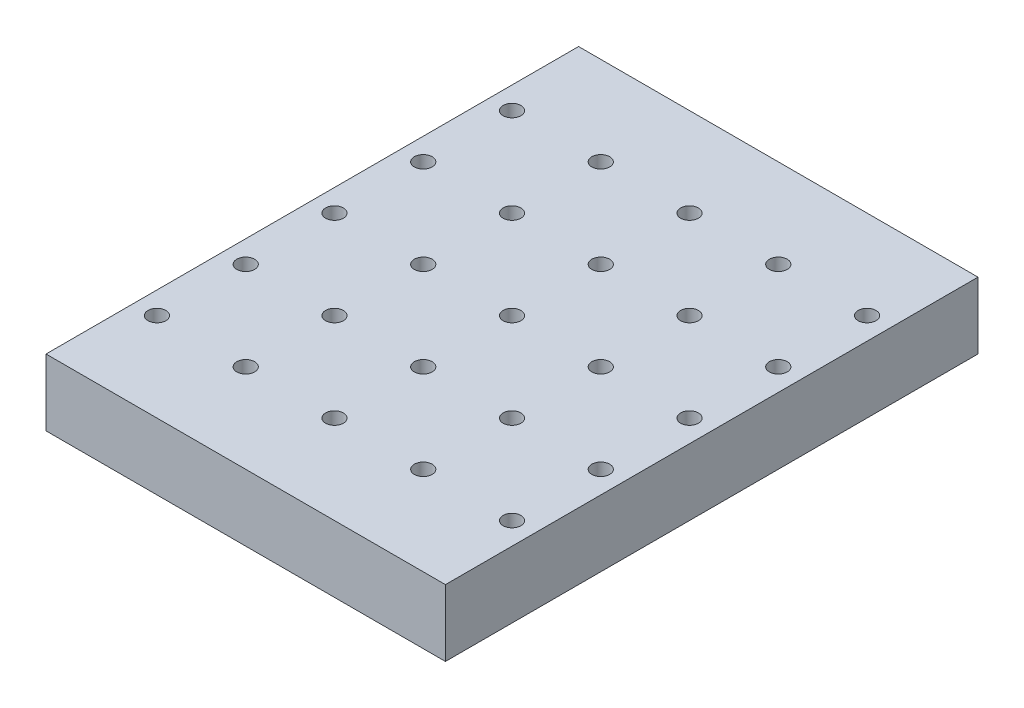
ISO-10303-21;
HEADER;
FILE_DESCRIPTION(('STEP AP214'),'2;1');
FILE_NAME('part.step','',(''),(''),'','','');
FILE_SCHEMA(('AUTOMOTIVE_DESIGN { 1 0 10303 214 1 1 1 1 }'));
ENDSEC;
DATA;
#1=APPLICATION_CONTEXT('core data for automotive mechanical design processes');
#2=APPLICATION_PROTOCOL_DEFINITION('international standard','automotive_design',2000,#1);
#3=PRODUCT_CONTEXT('',#1,'mechanical');
#4=PRODUCT('Part','Part','',(#3));
#5=PRODUCT_RELATED_PRODUCT_CATEGORY('part','',(#4));
#6=PRODUCT_DEFINITION_FORMATION('','',#4);
#7=PRODUCT_DEFINITION_CONTEXT('part definition',#1,'design');
#8=PRODUCT_DEFINITION('design','',#6,#7);
#9=PRODUCT_DEFINITION_SHAPE('','',#8);
#10=(LENGTH_UNIT() NAMED_UNIT(*) SI_UNIT(.MILLI.,.METRE.));
#11=(NAMED_UNIT(*) PLANE_ANGLE_UNIT() SI_UNIT($,.RADIAN.));
#12=(NAMED_UNIT(*) SI_UNIT($,.STERADIAN.) SOLID_ANGLE_UNIT());
#13=UNCERTAINTY_MEASURE_WITH_UNIT(LENGTH_MEASURE(1.E-05),#10,'distance_accuracy_value','');
#14=(GEOMETRIC_REPRESENTATION_CONTEXT(3) GLOBAL_UNCERTAINTY_ASSIGNED_CONTEXT((#13)) GLOBAL_UNIT_ASSIGNED_CONTEXT((#10,
#11,#12)) REPRESENTATION_CONTEXT('',''));
#15=CARTESIAN_POINT('',(0.,0.,0.));
#16=DIRECTION('',(0.,0.,1.));
#17=DIRECTION('',(1.,0.,0.));
#18=AXIS2_PLACEMENT_3D('',#15,#16,#17);
#19=CARTESIAN_POINT('',(-57.15,19.05,76.2));
#20=DIRECTION('',(1.,0.,0.));
#21=DIRECTION('',(0.,0.,-1.));
#22=AXIS2_PLACEMENT_3D('',#19,#20,#21);
#23=PLANE('',#22);
#24=DIRECTION('',(0.,0.,1.));
#25=VECTOR('',#24,1.);
#26=CARTESIAN_POINT('',(-57.15,0.,76.2));
#27=LINE('',#26,#25);
#28=CARTESIAN_POINT('',(-57.15,0.,-76.2));
#29=VERTEX_POINT('',#28);
#30=CARTESIAN_POINT('',(-57.15,0.,76.2));
#31=VERTEX_POINT('',#30);
#32=EDGE_CURVE('E100',#29,#31,#27,.T.);
#33=ORIENTED_EDGE('',*,*,#32,.T.);
#34=DIRECTION('',(0.,-1.,0.));
#35=VECTOR('',#34,1.);
#36=CARTESIAN_POINT('',(-57.15,19.05,76.2));
#37=LINE('',#36,#35);
#38=CARTESIAN_POINT('',(-57.15,19.05,76.2));
#39=VERTEX_POINT('',#38);
#40=EDGE_CURVE('E11',#39,#31,#37,.T.);
#41=ORIENTED_EDGE('',*,*,#40,.F.);
#42=DIRECTION('',(0.,0.,1.));
#43=VECTOR('',#42,1.);
#44=CARTESIAN_POINT('',(-57.15,19.05,76.2));
#45=LINE('',#44,#43);
#46=CARTESIAN_POINT('',(-57.15,19.05,-76.2));
#47=VERTEX_POINT('',#46);
#48=EDGE_CURVE('E88',#47,#39,#45,.T.);
#49=ORIENTED_EDGE('',*,*,#48,.F.);
#50=DIRECTION('',(0.,-1.,0.));
#51=VECTOR('',#50,1.);
#52=CARTESIAN_POINT('',(-57.15,19.05,-76.2));
#53=LINE('',#52,#51);
#54=EDGE_CURVE('E96',#47,#29,#53,.T.);
#55=ORIENTED_EDGE('',*,*,#54,.T.);
#56=EDGE_LOOP('',(#33,#41,#49,#55));
#57=FACE_BOUND('',#56,.T.);
#58=ADVANCED_FACE('F37',(#57),#23,.F.);
#59=CARTESIAN_POINT('',(57.15,19.05,76.2));
#60=DIRECTION('',(0.,0.,-1.));
#61=DIRECTION('',(-1.,0.,0.));
#62=AXIS2_PLACEMENT_3D('',#59,#60,#61);
#63=PLANE('',#62);
#64=DIRECTION('',(1.,0.,0.));
#65=VECTOR('',#64,1.);
#66=CARTESIAN_POINT('',(57.15,0.,76.2));
#67=LINE('',#66,#65);
#68=CARTESIAN_POINT('',(57.15,0.,76.2));
#69=VERTEX_POINT('',#68);
#70=EDGE_CURVE('E92',#31,#69,#67,.T.);
#71=ORIENTED_EDGE('',*,*,#70,.T.);
#72=DIRECTION('',(0.,-1.,0.));
#73=VECTOR('',#72,1.);
#74=CARTESIAN_POINT('',(57.15,19.05,76.2));
#75=LINE('',#74,#73);
#76=CARTESIAN_POINT('',(57.15,19.05,76.2));
#77=VERTEX_POINT('',#76);
#78=EDGE_CURVE('E45',#77,#69,#75,.T.);
#79=ORIENTED_EDGE('',*,*,#78,.F.);
#80=DIRECTION('',(1.,0.,0.));
#81=VECTOR('',#80,1.);
#82=CARTESIAN_POINT('',(57.15,19.05,76.2));
#83=LINE('',#82,#81);
#84=EDGE_CURVE('E83',#39,#77,#83,.T.);
#85=ORIENTED_EDGE('',*,*,#84,.F.);
#86=ORIENTED_EDGE('',*,*,#40,.T.);
#87=EDGE_LOOP('',(#71,#79,#85,#86));
#88=FACE_BOUND('',#87,.T.);
#89=ADVANCED_FACE('F91',(#88),#63,.F.);
#90=CARTESIAN_POINT('',(57.15,19.05,76.2));
#91=DIRECTION('',(-1.,0.,0.));
#92=DIRECTION('',(0.,0.,1.));
#93=AXIS2_PLACEMENT_3D('',#90,#91,#92);
#94=PLANE('',#93);
#95=DIRECTION('',(0.,0.,-1.));
#96=VECTOR('',#95,1.);
#97=CARTESIAN_POINT('',(57.15,0.,76.2));
#98=LINE('',#97,#96);
#99=CARTESIAN_POINT('',(57.15,0.,-76.2));
#100=VERTEX_POINT('',#99);
#101=EDGE_CURVE('E70',#69,#100,#98,.T.);
#102=ORIENTED_EDGE('',*,*,#101,.T.);
#103=DIRECTION('',(0.,-1.,0.));
#104=VECTOR('',#103,1.);
#105=CARTESIAN_POINT('',(57.15,19.05,-76.2));
#106=LINE('',#105,#104);
#107=CARTESIAN_POINT('',(57.15,19.05,-76.2));
#108=VERTEX_POINT('',#107);
#109=EDGE_CURVE('E93',#108,#100,#106,.T.);
#110=ORIENTED_EDGE('',*,*,#109,.F.);
#111=DIRECTION('',(0.,0.,-1.));
#112=VECTOR('',#111,1.);
#113=CARTESIAN_POINT('',(57.15,19.05,76.2));
#114=LINE('',#113,#112);
#115=EDGE_CURVE('E86',#77,#108,#114,.T.);
#116=ORIENTED_EDGE('',*,*,#115,.F.);
#117=ORIENTED_EDGE('',*,*,#78,.T.);
#118=EDGE_LOOP('',(#102,#110,#116,#117));
#119=FACE_BOUND('',#118,.T.);
#120=ADVANCED_FACE('F94',(#119),#94,.F.);
#121=CARTESIAN_POINT('',(57.15,19.05,-76.2));
#122=DIRECTION('',(0.,0.,1.));
#123=DIRECTION('',(1.,0.,0.));
#124=AXIS2_PLACEMENT_3D('',#121,#122,#123);
#125=PLANE('',#124);
#126=DIRECTION('',(-1.,0.,0.));
#127=VECTOR('',#126,1.);
#128=CARTESIAN_POINT('',(57.15,0.,-76.2));
#129=LINE('',#128,#127);
#130=EDGE_CURVE('E76',#100,#29,#129,.T.);
#131=ORIENTED_EDGE('',*,*,#130,.T.);
#132=ORIENTED_EDGE('',*,*,#54,.F.);
#133=DIRECTION('',(-1.,0.,0.));
#134=VECTOR('',#133,1.);
#135=CARTESIAN_POINT('',(57.15,19.05,-76.2));
#136=LINE('',#135,#134);
#137=EDGE_CURVE('E53',#108,#47,#136,.T.);
#138=ORIENTED_EDGE('',*,*,#137,.F.);
#139=ORIENTED_EDGE('',*,*,#109,.T.);
#140=EDGE_LOOP('',(#131,#132,#138,#139));
#141=FACE_BOUND('',#140,.T.);
#142=ADVANCED_FACE('F108',(#141),#125,.F.);
#143=CARTESIAN_POINT('',(0.,19.05,0.));
#144=DIRECTION('',(0.,1.,0.));
#145=DIRECTION('',(0.,0.,1.));
#146=AXIS2_PLACEMENT_3D('',#143,#144,#145);
#147=PLANE('',#146);
#148=CARTESIAN_POINT('',(50.8,19.05,50.8));
#149=DIRECTION('',(0.,1.,0.));
#150=DIRECTION('',(0.,0.,1.));
#151=AXIS2_PLACEMENT_3D('',#148,#149,#150);
#152=CIRCLE('',#151,2.55269999999999);
#153=CARTESIAN_POINT('',(50.8,19.05,53.3527));
#154=VERTEX_POINT('',#153);
#155=EDGE_CURVE('E260',#154,#154,#152,.T.);
#156=ORIENTED_EDGE('',*,*,#155,.F.);
#157=EDGE_LOOP('',(#156));
#158=FACE_BOUND('',#157,.T.);
#159=CARTESIAN_POINT('',(50.8,19.05,25.4));
#160=DIRECTION('',(0.,1.,0.));
#161=DIRECTION('',(0.,0.,1.));
#162=AXIS2_PLACEMENT_3D('',#159,#160,#161);
#163=CIRCLE('',#162,2.55269999999999);
#164=CARTESIAN_POINT('',(50.8,19.05,27.9527));
#165=VERTEX_POINT('',#164);
#166=EDGE_CURVE('E254',#165,#165,#163,.T.);
#167=ORIENTED_EDGE('',*,*,#166,.F.);
#168=EDGE_LOOP('',(#167));
#169=FACE_BOUND('',#168,.T.);
#170=CARTESIAN_POINT('',(50.8,19.05,-50.8));
#171=DIRECTION('',(0.,1.,0.));
#172=DIRECTION('',(0.,0.,1.));
#173=AXIS2_PLACEMENT_3D('',#170,#171,#172);
#174=CIRCLE('',#173,2.55269999999999);
#175=CARTESIAN_POINT('',(50.8,19.05,-48.2473));
#176=VERTEX_POINT('',#175);
#177=EDGE_CURVE('E248',#176,#176,#174,.T.);
#178=ORIENTED_EDGE('',*,*,#177,.F.);
#179=EDGE_LOOP('',(#178));
#180=FACE_BOUND('',#179,.T.);
#181=CARTESIAN_POINT('',(50.8,19.05,-25.4));
#182=DIRECTION('',(0.,1.,0.));
#183=DIRECTION('',(0.,0.,1.));
#184=AXIS2_PLACEMENT_3D('',#181,#182,#183);
#185=CIRCLE('',#184,2.55269999999999);
#186=CARTESIAN_POINT('',(50.8,19.05,-22.8473));
#187=VERTEX_POINT('',#186);
#188=EDGE_CURVE('E242',#187,#187,#185,.T.);
#189=ORIENTED_EDGE('',*,*,#188,.F.);
#190=EDGE_LOOP('',(#189));
#191=FACE_BOUND('',#190,.T.);
#192=CARTESIAN_POINT('',(50.8,19.05,0.));
#193=DIRECTION('',(0.,1.,0.));
#194=DIRECTION('',(0.,0.,1.));
#195=AXIS2_PLACEMENT_3D('',#192,#193,#194);
#196=CIRCLE('',#195,2.55269999999999);
#197=CARTESIAN_POINT('',(50.8,19.05,2.55269999999998));
#198=VERTEX_POINT('',#197);
#199=EDGE_CURVE('E236',#198,#198,#196,.T.);
#200=ORIENTED_EDGE('',*,*,#199,.F.);
#201=EDGE_LOOP('',(#200));
#202=FACE_BOUND('',#201,.T.);
#203=CARTESIAN_POINT('',(25.4,19.05,50.8));
#204=DIRECTION('',(0.,1.,0.));
#205=DIRECTION('',(0.,0.,1.));
#206=AXIS2_PLACEMENT_3D('',#203,#204,#205);
#207=CIRCLE('',#206,2.55269999999999);
#208=CARTESIAN_POINT('',(25.4,19.05,53.3527));
#209=VERTEX_POINT('',#208);
#210=EDGE_CURVE('E230',#209,#209,#207,.T.);
#211=ORIENTED_EDGE('',*,*,#210,.F.);
#212=EDGE_LOOP('',(#211));
#213=FACE_BOUND('',#212,.T.);
#214=CARTESIAN_POINT('',(25.4,19.05,25.4));
#215=DIRECTION('',(0.,1.,0.));
#216=DIRECTION('',(0.,0.,1.));
#217=AXIS2_PLACEMENT_3D('',#214,#215,#216);
#218=CIRCLE('',#217,2.55269999999999);
#219=CARTESIAN_POINT('',(25.4,19.05,27.9527));
#220=VERTEX_POINT('',#219);
#221=EDGE_CURVE('E224',#220,#220,#218,.T.);
#222=ORIENTED_EDGE('',*,*,#221,.F.);
#223=EDGE_LOOP('',(#222));
#224=FACE_BOUND('',#223,.T.);
#225=CARTESIAN_POINT('',(25.4,19.05,-50.8));
#226=DIRECTION('',(0.,1.,0.));
#227=DIRECTION('',(0.,0.,1.));
#228=AXIS2_PLACEMENT_3D('',#225,#226,#227);
#229=CIRCLE('',#228,2.55269999999999);
#230=CARTESIAN_POINT('',(25.4,19.05,-48.2473));
#231=VERTEX_POINT('',#230);
#232=EDGE_CURVE('E218',#231,#231,#229,.T.);
#233=ORIENTED_EDGE('',*,*,#232,.F.);
#234=EDGE_LOOP('',(#233));
#235=FACE_BOUND('',#234,.T.);
#236=CARTESIAN_POINT('',(25.4,19.05,-25.4));
#237=DIRECTION('',(0.,1.,0.));
#238=DIRECTION('',(0.,0.,1.));
#239=AXIS2_PLACEMENT_3D('',#236,#237,#238);
#240=CIRCLE('',#239,2.55269999999999);
#241=CARTESIAN_POINT('',(25.4,19.05,-22.8473));
#242=VERTEX_POINT('',#241);
#243=EDGE_CURVE('E212',#242,#242,#240,.T.);
#244=ORIENTED_EDGE('',*,*,#243,.F.);
#245=EDGE_LOOP('',(#244));
#246=FACE_BOUND('',#245,.T.);
#247=CARTESIAN_POINT('',(25.4,19.05,0.));
#248=DIRECTION('',(0.,1.,0.));
#249=DIRECTION('',(0.,0.,1.));
#250=AXIS2_PLACEMENT_3D('',#247,#248,#249);
#251=CIRCLE('',#250,2.55269999999999);
#252=CARTESIAN_POINT('',(25.4,19.05,2.55269999999998));
#253=VERTEX_POINT('',#252);
#254=EDGE_CURVE('E206',#253,#253,#251,.T.);
#255=ORIENTED_EDGE('',*,*,#254,.F.);
#256=EDGE_LOOP('',(#255));
#257=FACE_BOUND('',#256,.T.);
#258=CARTESIAN_POINT('',(-50.8,19.05,50.8));
#259=DIRECTION('',(0.,1.,0.));
#260=DIRECTION('',(0.,0.,1.));
#261=AXIS2_PLACEMENT_3D('',#258,#259,#260);
#262=CIRCLE('',#261,2.55269999999999);
#263=CARTESIAN_POINT('',(-50.8,19.05,53.3527));
#264=VERTEX_POINT('',#263);
#265=EDGE_CURVE('E200',#264,#264,#262,.T.);
#266=ORIENTED_EDGE('',*,*,#265,.F.);
#267=EDGE_LOOP('',(#266));
#268=FACE_BOUND('',#267,.T.);
#269=CARTESIAN_POINT('',(-50.8,19.05,25.4));
#270=DIRECTION('',(0.,1.,0.));
#271=DIRECTION('',(0.,0.,1.));
#272=AXIS2_PLACEMENT_3D('',#269,#270,#271);
#273=CIRCLE('',#272,2.55269999999999);
#274=CARTESIAN_POINT('',(-50.8,19.05,27.9527));
#275=VERTEX_POINT('',#274);
#276=EDGE_CURVE('E194',#275,#275,#273,.T.);
#277=ORIENTED_EDGE('',*,*,#276,.F.);
#278=EDGE_LOOP('',(#277));
#279=FACE_BOUND('',#278,.T.);
#280=CARTESIAN_POINT('',(-50.8,19.05,-50.8));
#281=DIRECTION('',(0.,1.,0.));
#282=DIRECTION('',(0.,0.,1.));
#283=AXIS2_PLACEMENT_3D('',#280,#281,#282);
#284=CIRCLE('',#283,2.55269999999999);
#285=CARTESIAN_POINT('',(-50.8,19.05,-48.2473));
#286=VERTEX_POINT('',#285);
#287=EDGE_CURVE('E188',#286,#286,#284,.T.);
#288=ORIENTED_EDGE('',*,*,#287,.F.);
#289=EDGE_LOOP('',(#288));
#290=FACE_BOUND('',#289,.T.);
#291=CARTESIAN_POINT('',(-50.8,19.05,-25.4));
#292=DIRECTION('',(0.,1.,0.));
#293=DIRECTION('',(0.,0.,1.));
#294=AXIS2_PLACEMENT_3D('',#291,#292,#293);
#295=CIRCLE('',#294,2.55269999999999);
#296=CARTESIAN_POINT('',(-50.8,19.05,-22.8473));
#297=VERTEX_POINT('',#296);
#298=EDGE_CURVE('E182',#297,#297,#295,.T.);
#299=ORIENTED_EDGE('',*,*,#298,.F.);
#300=EDGE_LOOP('',(#299));
#301=FACE_BOUND('',#300,.T.);
#302=CARTESIAN_POINT('',(-50.8,19.05,0.));
#303=DIRECTION('',(0.,1.,0.));
#304=DIRECTION('',(0.,0.,1.));
#305=AXIS2_PLACEMENT_3D('',#302,#303,#304);
#306=CIRCLE('',#305,2.55269999999999);
#307=CARTESIAN_POINT('',(-50.8,19.05,2.5527));
#308=VERTEX_POINT('',#307);
#309=EDGE_CURVE('E176',#308,#308,#306,.T.);
#310=ORIENTED_EDGE('',*,*,#309,.F.);
#311=EDGE_LOOP('',(#310));
#312=FACE_BOUND('',#311,.T.);
#313=CARTESIAN_POINT('',(-25.4,19.05,50.8));
#314=DIRECTION('',(0.,1.,0.));
#315=DIRECTION('',(0.,0.,1.));
#316=AXIS2_PLACEMENT_3D('',#313,#314,#315);
#317=CIRCLE('',#316,2.55269999999999);
#318=CARTESIAN_POINT('',(-25.4,19.05,53.3527));
#319=VERTEX_POINT('',#318);
#320=EDGE_CURVE('E170',#319,#319,#317,.T.);
#321=ORIENTED_EDGE('',*,*,#320,.F.);
#322=EDGE_LOOP('',(#321));
#323=FACE_BOUND('',#322,.T.);
#324=CARTESIAN_POINT('',(-25.4,19.05,25.4));
#325=DIRECTION('',(0.,1.,0.));
#326=DIRECTION('',(0.,0.,1.));
#327=AXIS2_PLACEMENT_3D('',#324,#325,#326);
#328=CIRCLE('',#327,2.55269999999999);
#329=CARTESIAN_POINT('',(-25.4,19.05,27.9527));
#330=VERTEX_POINT('',#329);
#331=EDGE_CURVE('E164',#330,#330,#328,.T.);
#332=ORIENTED_EDGE('',*,*,#331,.F.);
#333=EDGE_LOOP('',(#332));
#334=FACE_BOUND('',#333,.T.);
#335=CARTESIAN_POINT('',(-25.4,19.05,-50.8));
#336=DIRECTION('',(0.,1.,0.));
#337=DIRECTION('',(0.,0.,1.));
#338=AXIS2_PLACEMENT_3D('',#335,#336,#337);
#339=CIRCLE('',#338,2.55269999999999);
#340=CARTESIAN_POINT('',(-25.4,19.05,-48.2473));
#341=VERTEX_POINT('',#340);
#342=EDGE_CURVE('E158',#341,#341,#339,.T.);
#343=ORIENTED_EDGE('',*,*,#342,.F.);
#344=EDGE_LOOP('',(#343));
#345=FACE_BOUND('',#344,.T.);
#346=CARTESIAN_POINT('',(-25.4,19.05,-25.4));
#347=DIRECTION('',(0.,1.,0.));
#348=DIRECTION('',(0.,0.,1.));
#349=AXIS2_PLACEMENT_3D('',#346,#347,#348);
#350=CIRCLE('',#349,2.55269999999999);
#351=CARTESIAN_POINT('',(-25.4,19.05,-22.8473));
#352=VERTEX_POINT('',#351);
#353=EDGE_CURVE('E152',#352,#352,#350,.T.);
#354=ORIENTED_EDGE('',*,*,#353,.F.);
#355=EDGE_LOOP('',(#354));
#356=FACE_BOUND('',#355,.T.);
#357=CARTESIAN_POINT('',(-25.4,19.05,0.));
#358=DIRECTION('',(0.,1.,0.));
#359=DIRECTION('',(0.,0.,1.));
#360=AXIS2_PLACEMENT_3D('',#357,#358,#359);
#361=CIRCLE('',#360,2.55269999999999);
#362=CARTESIAN_POINT('',(-25.4,19.05,2.55269999999999));
#363=VERTEX_POINT('',#362);
#364=EDGE_CURVE('E146',#363,#363,#361,.T.);
#365=ORIENTED_EDGE('',*,*,#364,.F.);
#366=EDGE_LOOP('',(#365));
#367=FACE_BOUND('',#366,.T.);
#368=CARTESIAN_POINT('',(0.,19.05,50.8));
#369=DIRECTION('',(0.,1.,0.));
#370=DIRECTION('',(0.,0.,1.));
#371=AXIS2_PLACEMENT_3D('',#368,#369,#370);
#372=CIRCLE('',#371,2.55269999999999);
#373=CARTESIAN_POINT('',(0.,19.05,53.3527));
#374=VERTEX_POINT('',#373);
#375=EDGE_CURVE('E140',#374,#374,#372,.T.);
#376=ORIENTED_EDGE('',*,*,#375,.F.);
#377=EDGE_LOOP('',(#376));
#378=FACE_BOUND('',#377,.T.);
#379=CARTESIAN_POINT('',(0.,19.05,25.4));
#380=DIRECTION('',(0.,1.,0.));
#381=DIRECTION('',(0.,0.,1.));
#382=AXIS2_PLACEMENT_3D('',#379,#380,#381);
#383=CIRCLE('',#382,2.55269999999999);
#384=CARTESIAN_POINT('',(0.,19.05,27.9527));
#385=VERTEX_POINT('',#384);
#386=EDGE_CURVE('E134',#385,#385,#383,.T.);
#387=ORIENTED_EDGE('',*,*,#386,.F.);
#388=EDGE_LOOP('',(#387));
#389=FACE_BOUND('',#388,.T.);
#390=CARTESIAN_POINT('',(0.,19.05,-50.8));
#391=DIRECTION('',(0.,1.,0.));
#392=DIRECTION('',(0.,0.,1.));
#393=AXIS2_PLACEMENT_3D('',#390,#391,#392);
#394=CIRCLE('',#393,2.55269999999999);
#395=CARTESIAN_POINT('',(0.,19.05,-48.2473));
#396=VERTEX_POINT('',#395);
#397=EDGE_CURVE('E128',#396,#396,#394,.T.);
#398=ORIENTED_EDGE('',*,*,#397,.F.);
#399=EDGE_LOOP('',(#398));
#400=FACE_BOUND('',#399,.T.);
#401=CARTESIAN_POINT('',(0.,19.05,-25.4));
#402=DIRECTION('',(0.,1.,0.));
#403=DIRECTION('',(0.,0.,1.));
#404=AXIS2_PLACEMENT_3D('',#401,#402,#403);
#405=CIRCLE('',#404,2.55269999999999);
#406=CARTESIAN_POINT('',(0.,19.05,-22.8473));
#407=VERTEX_POINT('',#406);
#408=EDGE_CURVE('E122',#407,#407,#405,.T.);
#409=ORIENTED_EDGE('',*,*,#408,.F.);
#410=EDGE_LOOP('',(#409));
#411=FACE_BOUND('',#410,.T.);
#412=CARTESIAN_POINT('',(0.,19.05,0.));
#413=DIRECTION('',(0.,1.,0.));
#414=DIRECTION('',(0.,0.,1.));
#415=AXIS2_PLACEMENT_3D('',#412,#413,#414);
#416=CIRCLE('',#415,2.55269999999999);
#417=CARTESIAN_POINT('',(0.,19.05,2.55269999999999));
#418=VERTEX_POINT('',#417);
#419=EDGE_CURVE('E116',#418,#418,#416,.T.);
#420=ORIENTED_EDGE('',*,*,#419,.F.);
#421=EDGE_LOOP('',(#420));
#422=FACE_BOUND('',#421,.T.);
#423=ORIENTED_EDGE('',*,*,#48,.T.);
#424=ORIENTED_EDGE('',*,*,#84,.T.);
#425=ORIENTED_EDGE('',*,*,#115,.T.);
#426=ORIENTED_EDGE('',*,*,#137,.T.);
#427=EDGE_LOOP('',(#423,#424,#425,#426));
#428=FACE_BOUND('',#427,.T.);
#429=ADVANCED_FACE('F84',(#158,#169,#180,#191,#202,#213,#224,#235,#246,#257,#268,#279,#290,#301,
#312,#323,#334,#345,#356,#367,#378,#389,#400,#411,#422,#428),#147,.T.);
#430=CARTESIAN_POINT('',(0.,0.,0.));
#431=DIRECTION('',(0.,1.,0.));
#432=DIRECTION('',(0.,0.,1.));
#433=AXIS2_PLACEMENT_3D('',#430,#431,#432);
#434=PLANE('',#433);
#435=CARTESIAN_POINT('',(50.8,0.,50.8));
#436=DIRECTION('',(0.,1.,0.));
#437=DIRECTION('',(0.,0.,1.));
#438=AXIS2_PLACEMENT_3D('',#435,#436,#437);
#439=CIRCLE('',#438,2.5527);
#440=CARTESIAN_POINT('',(50.8,0.,53.3527));
#441=VERTEX_POINT('',#440);
#442=EDGE_CURVE('E257',#441,#441,#439,.T.);
#443=ORIENTED_EDGE('',*,*,#442,.T.);
#444=EDGE_LOOP('',(#443));
#445=FACE_BOUND('',#444,.T.);
#446=CARTESIAN_POINT('',(50.8,0.,25.4));
#447=DIRECTION('',(0.,1.,0.));
#448=DIRECTION('',(0.,0.,1.));
#449=AXIS2_PLACEMENT_3D('',#446,#447,#448);
#450=CIRCLE('',#449,2.5527);
#451=CARTESIAN_POINT('',(50.8,0.,27.9527));
#452=VERTEX_POINT('',#451);
#453=EDGE_CURVE('E251',#452,#452,#450,.T.);
#454=ORIENTED_EDGE('',*,*,#453,.T.);
#455=EDGE_LOOP('',(#454));
#456=FACE_BOUND('',#455,.T.);
#457=CARTESIAN_POINT('',(50.8,0.,-50.8));
#458=DIRECTION('',(0.,1.,0.));
#459=DIRECTION('',(0.,0.,1.));
#460=AXIS2_PLACEMENT_3D('',#457,#458,#459);
#461=CIRCLE('',#460,2.5527);
#462=CARTESIAN_POINT('',(50.8,0.,-48.2473));
#463=VERTEX_POINT('',#462);
#464=EDGE_CURVE('E245',#463,#463,#461,.T.);
#465=ORIENTED_EDGE('',*,*,#464,.T.);
#466=EDGE_LOOP('',(#465));
#467=FACE_BOUND('',#466,.T.);
#468=CARTESIAN_POINT('',(50.8,0.,-25.4));
#469=DIRECTION('',(0.,1.,0.));
#470=DIRECTION('',(0.,0.,1.));
#471=AXIS2_PLACEMENT_3D('',#468,#469,#470);
#472=CIRCLE('',#471,2.5527);
#473=CARTESIAN_POINT('',(50.8,0.,-22.8473));
#474=VERTEX_POINT('',#473);
#475=EDGE_CURVE('E239',#474,#474,#472,.T.);
#476=ORIENTED_EDGE('',*,*,#475,.T.);
#477=EDGE_LOOP('',(#476));
#478=FACE_BOUND('',#477,.T.);
#479=CARTESIAN_POINT('',(50.8,0.,0.));
#480=DIRECTION('',(0.,1.,0.));
#481=DIRECTION('',(0.,0.,1.));
#482=AXIS2_PLACEMENT_3D('',#479,#480,#481);
#483=CIRCLE('',#482,2.5527);
#484=CARTESIAN_POINT('',(50.8,0.,2.55269999999999));
#485=VERTEX_POINT('',#484);
#486=EDGE_CURVE('E233',#485,#485,#483,.T.);
#487=ORIENTED_EDGE('',*,*,#486,.T.);
#488=EDGE_LOOP('',(#487));
#489=FACE_BOUND('',#488,.T.);
#490=CARTESIAN_POINT('',(25.4,0.,50.8));
#491=DIRECTION('',(0.,1.,0.));
#492=DIRECTION('',(0.,0.,1.));
#493=AXIS2_PLACEMENT_3D('',#490,#491,#492);
#494=CIRCLE('',#493,2.55269999999999);
#495=CARTESIAN_POINT('',(25.4,0.,53.3527));
#496=VERTEX_POINT('',#495);
#497=EDGE_CURVE('E227',#496,#496,#494,.T.);
#498=ORIENTED_EDGE('',*,*,#497,.T.);
#499=EDGE_LOOP('',(#498));
#500=FACE_BOUND('',#499,.T.);
#501=CARTESIAN_POINT('',(25.4,0.,25.4));
#502=DIRECTION('',(0.,1.,0.));
#503=DIRECTION('',(0.,0.,1.));
#504=AXIS2_PLACEMENT_3D('',#501,#502,#503);
#505=CIRCLE('',#504,2.55269999999999);
#506=CARTESIAN_POINT('',(25.4,0.,27.9527));
#507=VERTEX_POINT('',#506);
#508=EDGE_CURVE('E221',#507,#507,#505,.T.);
#509=ORIENTED_EDGE('',*,*,#508,.T.);
#510=EDGE_LOOP('',(#509));
#511=FACE_BOUND('',#510,.T.);
#512=CARTESIAN_POINT('',(25.4,0.,-50.8));
#513=DIRECTION('',(0.,1.,0.));
#514=DIRECTION('',(0.,0.,1.));
#515=AXIS2_PLACEMENT_3D('',#512,#513,#514);
#516=CIRCLE('',#515,2.55269999999999);
#517=CARTESIAN_POINT('',(25.4,0.,-48.2473));
#518=VERTEX_POINT('',#517);
#519=EDGE_CURVE('E215',#518,#518,#516,.T.);
#520=ORIENTED_EDGE('',*,*,#519,.T.);
#521=EDGE_LOOP('',(#520));
#522=FACE_BOUND('',#521,.T.);
#523=CARTESIAN_POINT('',(25.4,0.,-25.4));
#524=DIRECTION('',(0.,1.,0.));
#525=DIRECTION('',(0.,0.,1.));
#526=AXIS2_PLACEMENT_3D('',#523,#524,#525);
#527=CIRCLE('',#526,2.55269999999999);
#528=CARTESIAN_POINT('',(25.4,0.,-22.8473));
#529=VERTEX_POINT('',#528);
#530=EDGE_CURVE('E209',#529,#529,#527,.T.);
#531=ORIENTED_EDGE('',*,*,#530,.T.);
#532=EDGE_LOOP('',(#531));
#533=FACE_BOUND('',#532,.T.);
#534=CARTESIAN_POINT('',(25.4,0.,0.));
#535=DIRECTION('',(0.,1.,0.));
#536=DIRECTION('',(0.,0.,1.));
#537=AXIS2_PLACEMENT_3D('',#534,#535,#536);
#538=CIRCLE('',#537,2.55269999999999);
#539=CARTESIAN_POINT('',(25.4,0.,2.55269999999999));
#540=VERTEX_POINT('',#539);
#541=EDGE_CURVE('E203',#540,#540,#538,.T.);
#542=ORIENTED_EDGE('',*,*,#541,.T.);
#543=EDGE_LOOP('',(#542));
#544=FACE_BOUND('',#543,.T.);
#545=CARTESIAN_POINT('',(-50.8,0.,50.8));
#546=DIRECTION('',(0.,1.,0.));
#547=DIRECTION('',(0.,0.,1.));
#548=AXIS2_PLACEMENT_3D('',#545,#546,#547);
#549=CIRCLE('',#548,2.5527);
#550=CARTESIAN_POINT('',(-50.8,0.,53.3527));
#551=VERTEX_POINT('',#550);
#552=EDGE_CURVE('E197',#551,#551,#549,.T.);
#553=ORIENTED_EDGE('',*,*,#552,.T.);
#554=EDGE_LOOP('',(#553));
#555=FACE_BOUND('',#554,.T.);
#556=CARTESIAN_POINT('',(-50.8,0.,25.4));
#557=DIRECTION('',(0.,1.,0.));
#558=DIRECTION('',(0.,0.,1.));
#559=AXIS2_PLACEMENT_3D('',#556,#557,#558);
#560=CIRCLE('',#559,2.5527);
#561=CARTESIAN_POINT('',(-50.8,0.,27.9527));
#562=VERTEX_POINT('',#561);
#563=EDGE_CURVE('E191',#562,#562,#560,.T.);
#564=ORIENTED_EDGE('',*,*,#563,.T.);
#565=EDGE_LOOP('',(#564));
#566=FACE_BOUND('',#565,.T.);
#567=CARTESIAN_POINT('',(-50.8,0.,-50.8));
#568=DIRECTION('',(0.,1.,0.));
#569=DIRECTION('',(0.,0.,1.));
#570=AXIS2_PLACEMENT_3D('',#567,#568,#569);
#571=CIRCLE('',#570,2.5527);
#572=CARTESIAN_POINT('',(-50.8,0.,-48.2473));
#573=VERTEX_POINT('',#572);
#574=EDGE_CURVE('E185',#573,#573,#571,.T.);
#575=ORIENTED_EDGE('',*,*,#574,.T.);
#576=EDGE_LOOP('',(#575));
#577=FACE_BOUND('',#576,.T.);
#578=CARTESIAN_POINT('',(-50.8,0.,-25.4));
#579=DIRECTION('',(0.,1.,0.));
#580=DIRECTION('',(0.,0.,1.));
#581=AXIS2_PLACEMENT_3D('',#578,#579,#580);
#582=CIRCLE('',#581,2.5527);
#583=CARTESIAN_POINT('',(-50.8,0.,-22.8473));
#584=VERTEX_POINT('',#583);
#585=EDGE_CURVE('E179',#584,#584,#582,.T.);
#586=ORIENTED_EDGE('',*,*,#585,.T.);
#587=EDGE_LOOP('',(#586));
#588=FACE_BOUND('',#587,.T.);
#589=CARTESIAN_POINT('',(-50.8,0.,0.));
#590=DIRECTION('',(0.,1.,0.));
#591=DIRECTION('',(0.,0.,1.));
#592=AXIS2_PLACEMENT_3D('',#589,#590,#591);
#593=CIRCLE('',#592,2.5527);
#594=CARTESIAN_POINT('',(-50.8,0.,2.55270000000001));
#595=VERTEX_POINT('',#594);
#596=EDGE_CURVE('E173',#595,#595,#593,.T.);
#597=ORIENTED_EDGE('',*,*,#596,.T.);
#598=EDGE_LOOP('',(#597));
#599=FACE_BOUND('',#598,.T.);
#600=CARTESIAN_POINT('',(-25.4,0.,50.8));
#601=DIRECTION('',(0.,1.,0.));
#602=DIRECTION('',(0.,0.,1.));
#603=AXIS2_PLACEMENT_3D('',#600,#601,#602);
#604=CIRCLE('',#603,2.55269999999999);
#605=CARTESIAN_POINT('',(-25.4,0.,53.3527));
#606=VERTEX_POINT('',#605);
#607=EDGE_CURVE('E167',#606,#606,#604,.T.);
#608=ORIENTED_EDGE('',*,*,#607,.T.);
#609=EDGE_LOOP('',(#608));
#610=FACE_BOUND('',#609,.T.);
#611=CARTESIAN_POINT('',(-25.4,0.,25.4));
#612=DIRECTION('',(0.,1.,0.));
#613=DIRECTION('',(0.,0.,1.));
#614=AXIS2_PLACEMENT_3D('',#611,#612,#613);
#615=CIRCLE('',#614,2.55269999999999);
#616=CARTESIAN_POINT('',(-25.4,0.,27.9527));
#617=VERTEX_POINT('',#616);
#618=EDGE_CURVE('E161',#617,#617,#615,.T.);
#619=ORIENTED_EDGE('',*,*,#618,.T.);
#620=EDGE_LOOP('',(#619));
#621=FACE_BOUND('',#620,.T.);
#622=CARTESIAN_POINT('',(-25.4,0.,-50.8));
#623=DIRECTION('',(0.,1.,0.));
#624=DIRECTION('',(0.,0.,1.));
#625=AXIS2_PLACEMENT_3D('',#622,#623,#624);
#626=CIRCLE('',#625,2.55269999999999);
#627=CARTESIAN_POINT('',(-25.4,0.,-48.2473));
#628=VERTEX_POINT('',#627);
#629=EDGE_CURVE('E155',#628,#628,#626,.T.);
#630=ORIENTED_EDGE('',*,*,#629,.T.);
#631=EDGE_LOOP('',(#630));
#632=FACE_BOUND('',#631,.T.);
#633=CARTESIAN_POINT('',(-25.4,0.,-25.4));
#634=DIRECTION('',(0.,1.,0.));
#635=DIRECTION('',(0.,0.,1.));
#636=AXIS2_PLACEMENT_3D('',#633,#634,#635);
#637=CIRCLE('',#636,2.55269999999999);
#638=CARTESIAN_POINT('',(-25.4,0.,-22.8473));
#639=VERTEX_POINT('',#638);
#640=EDGE_CURVE('E149',#639,#639,#637,.T.);
#641=ORIENTED_EDGE('',*,*,#640,.T.);
#642=EDGE_LOOP('',(#641));
#643=FACE_BOUND('',#642,.T.);
#644=CARTESIAN_POINT('',(-25.4,0.,0.));
#645=DIRECTION('',(0.,1.,0.));
#646=DIRECTION('',(0.,0.,1.));
#647=AXIS2_PLACEMENT_3D('',#644,#645,#646);
#648=CIRCLE('',#647,2.55269999999999);
#649=CARTESIAN_POINT('',(-25.4,0.,2.5527));
#650=VERTEX_POINT('',#649);
#651=EDGE_CURVE('E143',#650,#650,#648,.T.);
#652=ORIENTED_EDGE('',*,*,#651,.T.);
#653=EDGE_LOOP('',(#652));
#654=FACE_BOUND('',#653,.T.);
#655=CARTESIAN_POINT('',(0.,0.,50.8));
#656=DIRECTION('',(0.,1.,0.));
#657=DIRECTION('',(0.,0.,1.));
#658=AXIS2_PLACEMENT_3D('',#655,#656,#657);
#659=CIRCLE('',#658,2.5527);
#660=CARTESIAN_POINT('',(0.,0.,53.3527));
#661=VERTEX_POINT('',#660);
#662=EDGE_CURVE('E137',#661,#661,#659,.T.);
#663=ORIENTED_EDGE('',*,*,#662,.T.);
#664=EDGE_LOOP('',(#663));
#665=FACE_BOUND('',#664,.T.);
#666=CARTESIAN_POINT('',(0.,0.,25.4));
#667=DIRECTION('',(0.,1.,0.));
#668=DIRECTION('',(0.,0.,1.));
#669=AXIS2_PLACEMENT_3D('',#666,#667,#668);
#670=CIRCLE('',#669,2.5527);
#671=CARTESIAN_POINT('',(0.,0.,27.9527));
#672=VERTEX_POINT('',#671);
#673=EDGE_CURVE('E131',#672,#672,#670,.T.);
#674=ORIENTED_EDGE('',*,*,#673,.T.);
#675=EDGE_LOOP('',(#674));
#676=FACE_BOUND('',#675,.T.);
#677=CARTESIAN_POINT('',(0.,0.,-50.8));
#678=DIRECTION('',(0.,1.,0.));
#679=DIRECTION('',(0.,0.,1.));
#680=AXIS2_PLACEMENT_3D('',#677,#678,#679);
#681=CIRCLE('',#680,2.5527);
#682=CARTESIAN_POINT('',(0.,0.,-48.2473));
#683=VERTEX_POINT('',#682);
#684=EDGE_CURVE('E125',#683,#683,#681,.T.);
#685=ORIENTED_EDGE('',*,*,#684,.T.);
#686=EDGE_LOOP('',(#685));
#687=FACE_BOUND('',#686,.T.);
#688=CARTESIAN_POINT('',(0.,0.,-25.4));
#689=DIRECTION('',(0.,1.,0.));
#690=DIRECTION('',(0.,0.,1.));
#691=AXIS2_PLACEMENT_3D('',#688,#689,#690);
#692=CIRCLE('',#691,2.5527);
#693=CARTESIAN_POINT('',(0.,0.,-22.8473));
#694=VERTEX_POINT('',#693);
#695=EDGE_CURVE('E119',#694,#694,#692,.T.);
#696=ORIENTED_EDGE('',*,*,#695,.T.);
#697=EDGE_LOOP('',(#696));
#698=FACE_BOUND('',#697,.T.);
#699=CARTESIAN_POINT('',(0.,0.,0.));
#700=DIRECTION('',(0.,1.,0.));
#701=DIRECTION('',(0.,0.,1.));
#702=AXIS2_PLACEMENT_3D('',#699,#700,#701);
#703=CIRCLE('',#702,2.5527);
#704=CARTESIAN_POINT('',(0.,0.,2.5527));
#705=VERTEX_POINT('',#704);
#706=EDGE_CURVE('E103',#705,#705,#703,.T.);
#707=ORIENTED_EDGE('',*,*,#706,.T.);
#708=EDGE_LOOP('',(#707));
#709=FACE_BOUND('',#708,.T.);
#710=ORIENTED_EDGE('',*,*,#32,.F.);
#711=ORIENTED_EDGE('',*,*,#130,.F.);
#712=ORIENTED_EDGE('',*,*,#101,.F.);
#713=ORIENTED_EDGE('',*,*,#70,.F.);
#714=EDGE_LOOP('',(#710,#711,#712,#713));
#715=FACE_BOUND('',#714,.T.);
#716=ADVANCED_FACE('F111',(#445,#456,#467,#478,#489,#500,#511,#522,#533,#544,#555,#566,#577,
#588,#599,#610,#621,#632,#643,#654,#665,#676,#687,#698,#709,#715),#434,.F.);
#717=CARTESIAN_POINT('',(0.,19.05,0.));
#718=DIRECTION('',(0.,1.,0.));
#719=DIRECTION('',(0.,0.,1.));
#720=AXIS2_PLACEMENT_3D('',#717,#718,#719);
#721=CYLINDRICAL_SURFACE('',#720,2.55269999999999);
#722=ORIENTED_EDGE('',*,*,#706,.F.);
#723=EDGE_LOOP('',(#722));
#724=FACE_BOUND('',#723,.T.);
#725=ORIENTED_EDGE('',*,*,#419,.T.);
#726=EDGE_LOOP('',(#725));
#727=FACE_BOUND('',#726,.T.);
#728=ADVANCED_FACE('F317',(#724,#727),#721,.F.);
#729=CARTESIAN_POINT('',(0.,19.05,-25.4));
#730=DIRECTION('',(0.,1.,0.));
#731=DIRECTION('',(0.,0.,1.));
#732=AXIS2_PLACEMENT_3D('',#729,#730,#731);
#733=CYLINDRICAL_SURFACE('',#732,2.55269999999999);
#734=ORIENTED_EDGE('',*,*,#695,.F.);
#735=EDGE_LOOP('',(#734));
#736=FACE_BOUND('',#735,.T.);
#737=ORIENTED_EDGE('',*,*,#408,.T.);
#738=EDGE_LOOP('',(#737));
#739=FACE_BOUND('',#738,.T.);
#740=ADVANCED_FACE('F319',(#736,#739),#733,.F.);
#741=CARTESIAN_POINT('',(0.,19.05,-50.8));
#742=DIRECTION('',(0.,1.,0.));
#743=DIRECTION('',(0.,0.,1.));
#744=AXIS2_PLACEMENT_3D('',#741,#742,#743);
#745=CYLINDRICAL_SURFACE('',#744,2.55269999999999);
#746=ORIENTED_EDGE('',*,*,#684,.F.);
#747=EDGE_LOOP('',(#746));
#748=FACE_BOUND('',#747,.T.);
#749=ORIENTED_EDGE('',*,*,#397,.T.);
#750=EDGE_LOOP('',(#749));
#751=FACE_BOUND('',#750,.T.);
#752=ADVANCED_FACE('F326',(#748,#751),#745,.F.);
#753=CARTESIAN_POINT('',(0.,19.05,25.4));
#754=DIRECTION('',(0.,1.,0.));
#755=DIRECTION('',(0.,0.,1.));
#756=AXIS2_PLACEMENT_3D('',#753,#754,#755);
#757=CYLINDRICAL_SURFACE('',#756,2.55269999999999);
#758=ORIENTED_EDGE('',*,*,#673,.F.);
#759=EDGE_LOOP('',(#758));
#760=FACE_BOUND('',#759,.T.);
#761=ORIENTED_EDGE('',*,*,#386,.T.);
#762=EDGE_LOOP('',(#761));
#763=FACE_BOUND('',#762,.T.);
#764=ADVANCED_FACE('F609',(#760,#763),#757,.F.);
#765=CARTESIAN_POINT('',(0.,19.05,50.8));
#766=DIRECTION('',(0.,1.,0.));
#767=DIRECTION('',(0.,0.,1.));
#768=AXIS2_PLACEMENT_3D('',#765,#766,#767);
#769=CYLINDRICAL_SURFACE('',#768,2.55269999999999);
#770=ORIENTED_EDGE('',*,*,#662,.F.);
#771=EDGE_LOOP('',(#770));
#772=FACE_BOUND('',#771,.T.);
#773=ORIENTED_EDGE('',*,*,#375,.T.);
#774=EDGE_LOOP('',(#773));
#775=FACE_BOUND('',#774,.T.);
#776=ADVANCED_FACE('F371',(#772,#775),#769,.F.);
#777=CARTESIAN_POINT('',(-25.4,19.05,0.));
#778=DIRECTION('',(0.,1.,0.));
#779=DIRECTION('',(0.,0.,1.));
#780=AXIS2_PLACEMENT_3D('',#777,#778,#779);
#781=CYLINDRICAL_SURFACE('',#780,2.55269999999999);
#782=ORIENTED_EDGE('',*,*,#651,.F.);
#783=EDGE_LOOP('',(#782));
#784=FACE_BOUND('',#783,.T.);
#785=ORIENTED_EDGE('',*,*,#364,.T.);
#786=EDGE_LOOP('',(#785));
#787=FACE_BOUND('',#786,.T.);
#788=ADVANCED_FACE('F364',(#784,#787),#781,.F.);
#789=CARTESIAN_POINT('',(-25.4,19.05,-25.4));
#790=DIRECTION('',(0.,1.,0.));
#791=DIRECTION('',(0.,0.,1.));
#792=AXIS2_PLACEMENT_3D('',#789,#790,#791);
#793=CYLINDRICAL_SURFACE('',#792,2.55269999999999);
#794=ORIENTED_EDGE('',*,*,#640,.F.);
#795=EDGE_LOOP('',(#794));
#796=FACE_BOUND('',#795,.T.);
#797=ORIENTED_EDGE('',*,*,#353,.T.);
#798=EDGE_LOOP('',(#797));
#799=FACE_BOUND('',#798,.T.);
#800=ADVANCED_FACE('F370',(#796,#799),#793,.F.);
#801=CARTESIAN_POINT('',(-25.4,19.05,-50.8));
#802=DIRECTION('',(0.,1.,0.));
#803=DIRECTION('',(0.,0.,1.));
#804=AXIS2_PLACEMENT_3D('',#801,#802,#803);
#805=CYLINDRICAL_SURFACE('',#804,2.55269999999999);
#806=ORIENTED_EDGE('',*,*,#629,.F.);
#807=EDGE_LOOP('',(#806));
#808=FACE_BOUND('',#807,.T.);
#809=ORIENTED_EDGE('',*,*,#342,.T.);
#810=EDGE_LOOP('',(#809));
#811=FACE_BOUND('',#810,.T.);
#812=ADVANCED_FACE('F385',(#808,#811),#805,.F.);
#813=CARTESIAN_POINT('',(-25.4,19.05,25.4));
#814=DIRECTION('',(0.,1.,0.));
#815=DIRECTION('',(0.,0.,1.));
#816=AXIS2_PLACEMENT_3D('',#813,#814,#815);
#817=CYLINDRICAL_SURFACE('',#816,2.55269999999999);
#818=ORIENTED_EDGE('',*,*,#618,.F.);
#819=EDGE_LOOP('',(#818));
#820=FACE_BOUND('',#819,.T.);
#821=ORIENTED_EDGE('',*,*,#331,.T.);
#822=EDGE_LOOP('',(#821));
#823=FACE_BOUND('',#822,.T.);
#824=ADVANCED_FACE('F398',(#820,#823),#817,.F.);
#825=CARTESIAN_POINT('',(-25.4,19.05,50.8));
#826=DIRECTION('',(0.,1.,0.));
#827=DIRECTION('',(0.,0.,1.));
#828=AXIS2_PLACEMENT_3D('',#825,#826,#827);
#829=CYLINDRICAL_SURFACE('',#828,2.55269999999999);
#830=ORIENTED_EDGE('',*,*,#607,.F.);
#831=EDGE_LOOP('',(#830));
#832=FACE_BOUND('',#831,.T.);
#833=ORIENTED_EDGE('',*,*,#320,.T.);
#834=EDGE_LOOP('',(#833));
#835=FACE_BOUND('',#834,.T.);
#836=ADVANCED_FACE('F410',(#832,#835),#829,.F.);
#837=CARTESIAN_POINT('',(-50.8,19.05,0.));
#838=DIRECTION('',(0.,1.,0.));
#839=DIRECTION('',(0.,0.,1.));
#840=AXIS2_PLACEMENT_3D('',#837,#838,#839);
#841=CYLINDRICAL_SURFACE('',#840,2.55269999999999);
#842=ORIENTED_EDGE('',*,*,#596,.F.);
#843=EDGE_LOOP('',(#842));
#844=FACE_BOUND('',#843,.T.);
#845=ORIENTED_EDGE('',*,*,#309,.T.);
#846=EDGE_LOOP('',(#845));
#847=FACE_BOUND('',#846,.T.);
#848=ADVANCED_FACE('F422',(#844,#847),#841,.F.);
#849=CARTESIAN_POINT('',(-50.8,19.05,-25.4));
#850=DIRECTION('',(0.,1.,0.));
#851=DIRECTION('',(0.,0.,1.));
#852=AXIS2_PLACEMENT_3D('',#849,#850,#851);
#853=CYLINDRICAL_SURFACE('',#852,2.55269999999999);
#854=ORIENTED_EDGE('',*,*,#585,.F.);
#855=EDGE_LOOP('',(#854));
#856=FACE_BOUND('',#855,.T.);
#857=ORIENTED_EDGE('',*,*,#298,.T.);
#858=EDGE_LOOP('',(#857));
#859=FACE_BOUND('',#858,.T.);
#860=ADVANCED_FACE('F435',(#856,#859),#853,.F.);
#861=CARTESIAN_POINT('',(-50.8,19.05,-50.8));
#862=DIRECTION('',(0.,1.,0.));
#863=DIRECTION('',(0.,0.,1.));
#864=AXIS2_PLACEMENT_3D('',#861,#862,#863);
#865=CYLINDRICAL_SURFACE('',#864,2.55269999999999);
#866=ORIENTED_EDGE('',*,*,#574,.F.);
#867=EDGE_LOOP('',(#866));
#868=FACE_BOUND('',#867,.T.);
#869=ORIENTED_EDGE('',*,*,#287,.T.);
#870=EDGE_LOOP('',(#869));
#871=FACE_BOUND('',#870,.T.);
#872=ADVANCED_FACE('F446',(#868,#871),#865,.F.);
#873=CARTESIAN_POINT('',(-50.8,19.05,25.4));
#874=DIRECTION('',(0.,1.,0.));
#875=DIRECTION('',(0.,0.,1.));
#876=AXIS2_PLACEMENT_3D('',#873,#874,#875);
#877=CYLINDRICAL_SURFACE('',#876,2.55269999999999);
#878=ORIENTED_EDGE('',*,*,#563,.F.);
#879=EDGE_LOOP('',(#878));
#880=FACE_BOUND('',#879,.T.);
#881=ORIENTED_EDGE('',*,*,#276,.T.);
#882=EDGE_LOOP('',(#881));
#883=FACE_BOUND('',#882,.T.);
#884=ADVANCED_FACE('F457',(#880,#883),#877,.F.);
#885=CARTESIAN_POINT('',(-50.8,19.05,50.8));
#886=DIRECTION('',(0.,1.,0.));
#887=DIRECTION('',(0.,0.,1.));
#888=AXIS2_PLACEMENT_3D('',#885,#886,#887);
#889=CYLINDRICAL_SURFACE('',#888,2.55269999999999);
#890=ORIENTED_EDGE('',*,*,#552,.F.);
#891=EDGE_LOOP('',(#890));
#892=FACE_BOUND('',#891,.T.);
#893=ORIENTED_EDGE('',*,*,#265,.T.);
#894=EDGE_LOOP('',(#893));
#895=FACE_BOUND('',#894,.T.);
#896=ADVANCED_FACE('F469',(#892,#895),#889,.F.);
#897=CARTESIAN_POINT('',(25.4,19.05,0.));
#898=DIRECTION('',(0.,1.,0.));
#899=DIRECTION('',(0.,0.,1.));
#900=AXIS2_PLACEMENT_3D('',#897,#898,#899);
#901=CYLINDRICAL_SURFACE('',#900,2.55269999999999);
#902=ORIENTED_EDGE('',*,*,#541,.F.);
#903=EDGE_LOOP('',(#902));
#904=FACE_BOUND('',#903,.T.);
#905=ORIENTED_EDGE('',*,*,#254,.T.);
#906=EDGE_LOOP('',(#905));
#907=FACE_BOUND('',#906,.T.);
#908=ADVANCED_FACE('F481',(#904,#907),#901,.F.);
#909=CARTESIAN_POINT('',(25.4,19.05,-25.4));
#910=DIRECTION('',(0.,1.,0.));
#911=DIRECTION('',(0.,0.,1.));
#912=AXIS2_PLACEMENT_3D('',#909,#910,#911);
#913=CYLINDRICAL_SURFACE('',#912,2.55269999999999);
#914=ORIENTED_EDGE('',*,*,#530,.F.);
#915=EDGE_LOOP('',(#914));
#916=FACE_BOUND('',#915,.T.);
#917=ORIENTED_EDGE('',*,*,#243,.T.);
#918=EDGE_LOOP('',(#917));
#919=FACE_BOUND('',#918,.T.);
#920=ADVANCED_FACE('F492',(#916,#919),#913,.F.);
#921=CARTESIAN_POINT('',(25.4,19.05,-50.8));
#922=DIRECTION('',(0.,1.,0.));
#923=DIRECTION('',(0.,0.,1.));
#924=AXIS2_PLACEMENT_3D('',#921,#922,#923);
#925=CYLINDRICAL_SURFACE('',#924,2.55269999999999);
#926=ORIENTED_EDGE('',*,*,#519,.F.);
#927=EDGE_LOOP('',(#926));
#928=FACE_BOUND('',#927,.T.);
#929=ORIENTED_EDGE('',*,*,#232,.T.);
#930=EDGE_LOOP('',(#929));
#931=FACE_BOUND('',#930,.T.);
#932=ADVANCED_FACE('F502',(#928,#931),#925,.F.);
#933=CARTESIAN_POINT('',(25.4,19.05,25.4));
#934=DIRECTION('',(0.,1.,0.));
#935=DIRECTION('',(0.,0.,1.));
#936=AXIS2_PLACEMENT_3D('',#933,#934,#935);
#937=CYLINDRICAL_SURFACE('',#936,2.55269999999999);
#938=ORIENTED_EDGE('',*,*,#508,.F.);
#939=EDGE_LOOP('',(#938));
#940=FACE_BOUND('',#939,.T.);
#941=ORIENTED_EDGE('',*,*,#221,.T.);
#942=EDGE_LOOP('',(#941));
#943=FACE_BOUND('',#942,.T.);
#944=ADVANCED_FACE('F512',(#940,#943),#937,.F.);
#945=CARTESIAN_POINT('',(25.4,19.05,50.8));
#946=DIRECTION('',(0.,1.,0.));
#947=DIRECTION('',(0.,0.,1.));
#948=AXIS2_PLACEMENT_3D('',#945,#946,#947);
#949=CYLINDRICAL_SURFACE('',#948,2.55269999999999);
#950=ORIENTED_EDGE('',*,*,#497,.F.);
#951=EDGE_LOOP('',(#950));
#952=FACE_BOUND('',#951,.T.);
#953=ORIENTED_EDGE('',*,*,#210,.T.);
#954=EDGE_LOOP('',(#953));
#955=FACE_BOUND('',#954,.T.);
#956=ADVANCED_FACE('F522',(#952,#955),#949,.F.);
#957=CARTESIAN_POINT('',(50.8,19.05,0.));
#958=DIRECTION('',(0.,1.,0.));
#959=DIRECTION('',(0.,0.,1.));
#960=AXIS2_PLACEMENT_3D('',#957,#958,#959);
#961=CYLINDRICAL_SURFACE('',#960,2.55269999999999);
#962=ORIENTED_EDGE('',*,*,#486,.F.);
#963=EDGE_LOOP('',(#962));
#964=FACE_BOUND('',#963,.T.);
#965=ORIENTED_EDGE('',*,*,#199,.T.);
#966=EDGE_LOOP('',(#965));
#967=FACE_BOUND('',#966,.T.);
#968=ADVANCED_FACE('F532',(#964,#967),#961,.F.);
#969=CARTESIAN_POINT('',(50.8,19.05,-25.4));
#970=DIRECTION('',(0.,1.,0.));
#971=DIRECTION('',(0.,0.,1.));
#972=AXIS2_PLACEMENT_3D('',#969,#970,#971);
#973=CYLINDRICAL_SURFACE('',#972,2.55269999999999);
#974=ORIENTED_EDGE('',*,*,#475,.F.);
#975=EDGE_LOOP('',(#974));
#976=FACE_BOUND('',#975,.T.);
#977=ORIENTED_EDGE('',*,*,#188,.T.);
#978=EDGE_LOOP('',(#977));
#979=FACE_BOUND('',#978,.T.);
#980=ADVANCED_FACE('F542',(#976,#979),#973,.F.);
#981=CARTESIAN_POINT('',(50.8,19.05,-50.8));
#982=DIRECTION('',(0.,1.,0.));
#983=DIRECTION('',(0.,0.,1.));
#984=AXIS2_PLACEMENT_3D('',#981,#982,#983);
#985=CYLINDRICAL_SURFACE('',#984,2.55269999999999);
#986=ORIENTED_EDGE('',*,*,#464,.F.);
#987=EDGE_LOOP('',(#986));
#988=FACE_BOUND('',#987,.T.);
#989=ORIENTED_EDGE('',*,*,#177,.T.);
#990=EDGE_LOOP('',(#989));
#991=FACE_BOUND('',#990,.T.);
#992=ADVANCED_FACE('F552',(#988,#991),#985,.F.);
#993=CARTESIAN_POINT('',(50.8,19.05,25.4));
#994=DIRECTION('',(0.,1.,0.));
#995=DIRECTION('',(0.,0.,1.));
#996=AXIS2_PLACEMENT_3D('',#993,#994,#995);
#997=CYLINDRICAL_SURFACE('',#996,2.55269999999999);
#998=ORIENTED_EDGE('',*,*,#453,.F.);
#999=EDGE_LOOP('',(#998));
#1000=FACE_BOUND('',#999,.T.);
#1001=ORIENTED_EDGE('',*,*,#166,.T.);
#1002=EDGE_LOOP('',(#1001));
#1003=FACE_BOUND('',#1002,.T.);
#1004=ADVANCED_FACE('F562',(#1000,#1003),#997,.F.);
#1005=CARTESIAN_POINT('',(50.8,19.05,50.8));
#1006=DIRECTION('',(0.,1.,0.));
#1007=DIRECTION('',(0.,0.,1.));
#1008=AXIS2_PLACEMENT_3D('',#1005,#1006,#1007);
#1009=CYLINDRICAL_SURFACE('',#1008,2.55269999999999);
#1010=ORIENTED_EDGE('',*,*,#442,.F.);
#1011=EDGE_LOOP('',(#1010));
#1012=FACE_BOUND('',#1011,.T.);
#1013=ORIENTED_EDGE('',*,*,#155,.T.);
#1014=EDGE_LOOP('',(#1013));
#1015=FACE_BOUND('',#1014,.T.);
#1016=ADVANCED_FACE('F264',(#1012,#1015),#1009,.F.);
#1017=CLOSED_SHELL('',(#58,#89,#120,#142,#429,#716,#728,#740,#752,#764,#776,#788,#800,#812,#824,
#836,#848,#860,#872,#884,#896,#908,#920,#932,#944,#956,#968,#980,#992,#1004,#1016));
#1018=MANIFOLD_SOLID_BREP('B2',#1017);
#1019=ADVANCED_BREP_SHAPE_REPRESENTATION('',(#18,#1018),#14);
#1020=SHAPE_DEFINITION_REPRESENTATION(#9,#1019);
ENDSEC;
END-ISO-10303-21;
